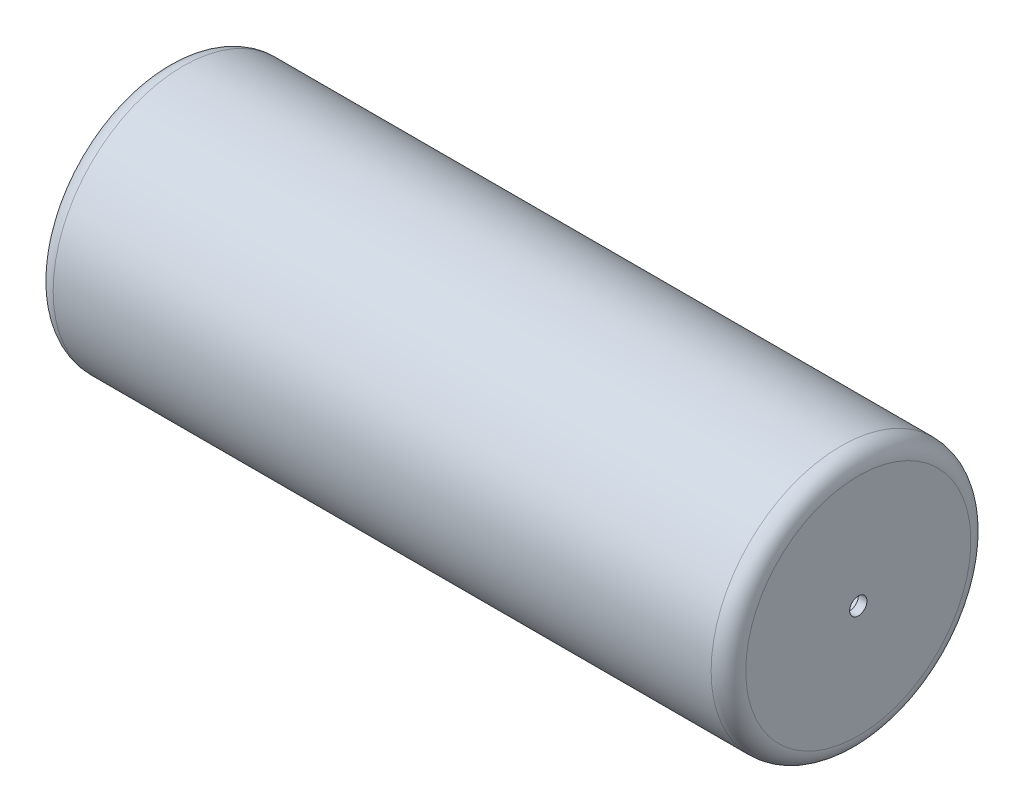
ISO-10303-21;
HEADER;
FILE_DESCRIPTION(('STEP AP214'),'2;1');
FILE_NAME('part.step','',(''),(''),'','','');
FILE_SCHEMA(('AUTOMOTIVE_DESIGN { 1 0 10303 214 1 1 1 1 }'));
ENDSEC;
DATA;
#1=APPLICATION_CONTEXT('core data for automotive mechanical design processes');
#2=APPLICATION_PROTOCOL_DEFINITION('international standard','automotive_design',2000,#1);
#3=PRODUCT_CONTEXT('',#1,'mechanical');
#4=PRODUCT('Part','Part','',(#3));
#5=PRODUCT_RELATED_PRODUCT_CATEGORY('part','',(#4));
#6=PRODUCT_DEFINITION_FORMATION('','',#4);
#7=PRODUCT_DEFINITION_CONTEXT('part definition',#1,'design');
#8=PRODUCT_DEFINITION('design','',#6,#7);
#9=PRODUCT_DEFINITION_SHAPE('','',#8);
#10=(LENGTH_UNIT() NAMED_UNIT(*) SI_UNIT(.MILLI.,.METRE.));
#11=(NAMED_UNIT(*) PLANE_ANGLE_UNIT() SI_UNIT($,.RADIAN.));
#12=(NAMED_UNIT(*) SI_UNIT($,.STERADIAN.) SOLID_ANGLE_UNIT());
#13=UNCERTAINTY_MEASURE_WITH_UNIT(LENGTH_MEASURE(1.E-05),#10,'distance_accuracy_value','');
#14=(GEOMETRIC_REPRESENTATION_CONTEXT(3) GLOBAL_UNCERTAINTY_ASSIGNED_CONTEXT((#13)) GLOBAL_UNIT_ASSIGNED_CONTEXT((#10,
#11,#12)) REPRESENTATION_CONTEXT('',''));
#15=CARTESIAN_POINT('',(0.,0.,0.));
#16=DIRECTION('',(0.,0.,1.));
#17=DIRECTION('',(1.,0.,0.));
#18=AXIS2_PLACEMENT_3D('',#15,#16,#17);
#19=CARTESIAN_POINT('',(0.,15.,0.));
#20=DIRECTION('',(1.,0.,0.));
#21=DIRECTION('',(0.,0.,-1.));
#22=AXIS2_PLACEMENT_3D('',#19,#20,#21);
#23=PLANE('',#22);
#24=CARTESIAN_POINT('',(0.,0.,0.));
#25=DIRECTION('',(1.,0.,0.));
#26=DIRECTION('',(0.,0.,-1.));
#27=AXIS2_PLACEMENT_3D('',#24,#25,#26);
#28=CIRCLE('',#27,13.);
#29=CARTESIAN_POINT('',(0.,0.,-13.));
#30=VERTEX_POINT('',#29);
#31=EDGE_CURVE('E61',#30,#30,#28,.F.);
#32=ORIENTED_EDGE('',*,*,#31,.T.);
#33=EDGE_LOOP('',(#32));
#34=FACE_BOUND('',#33,.T.);
#35=ADVANCED_FACE('F43',(#34),#23,.F.);
#36=CARTESIAN_POINT('',(80.,0.,0.));
#37=DIRECTION('',(-1.,0.,0.));
#38=DIRECTION('',(0.,0.,1.));
#39=AXIS2_PLACEMENT_3D('',#36,#37,#38);
#40=PLANE('',#39);
#41=CARTESIAN_POINT('',(80.,0.,0.));
#42=DIRECTION('',(-1.,0.,0.));
#43=DIRECTION('',(0.,0.,1.));
#44=AXIS2_PLACEMENT_3D('',#41,#42,#43);
#45=CIRCLE('',#44,13.);
#46=CARTESIAN_POINT('',(80.,0.,13.));
#47=VERTEX_POINT('',#46);
#48=EDGE_CURVE('E10',#47,#47,#45,.F.);
#49=ORIENTED_EDGE('',*,*,#48,.T.);
#50=EDGE_LOOP('',(#49));
#51=FACE_BOUND('',#50,.T.);
#52=CARTESIAN_POINT('',(80.,0.,0.));
#53=DIRECTION('',(1.,0.,0.));
#54=DIRECTION('',(0.,0.,-1.));
#55=AXIS2_PLACEMENT_3D('',#52,#53,#54);
#56=CIRCLE('',#55,1.);
#57=CARTESIAN_POINT('',(80.,0.,-1.));
#58=VERTEX_POINT('',#57);
#59=EDGE_CURVE('E73',#58,#58,#56,.T.);
#60=ORIENTED_EDGE('',*,*,#59,.F.);
#61=EDGE_LOOP('',(#60));
#62=FACE_BOUND('',#61,.T.);
#63=ADVANCED_FACE('F86',(#51,#62),#40,.F.);
#64=CARTESIAN_POINT('',(0.,0.,0.));
#65=DIRECTION('',(-1.,0.,0.));
#66=DIRECTION('',(0.,0.,1.));
#67=AXIS2_PLACEMENT_3D('',#64,#65,#66);
#68=CYLINDRICAL_SURFACE('',#67,15.);
#69=CARTESIAN_POINT('',(2.,0.,0.));
#70=DIRECTION('',(1.,0.,0.));
#71=DIRECTION('',(0.,0.,-1.));
#72=AXIS2_PLACEMENT_3D('',#69,#70,#71);
#73=CIRCLE('',#72,15.);
#74=CARTESIAN_POINT('',(2.,0.,-15.));
#75=VERTEX_POINT('',#74);
#76=EDGE_CURVE('E51',#75,#75,#73,.T.);
#77=ORIENTED_EDGE('',*,*,#76,.T.);
#78=EDGE_LOOP('',(#77));
#79=FACE_BOUND('',#78,.T.);
#80=CARTESIAN_POINT('',(78.,0.,0.));
#81=DIRECTION('',(-1.,0.,0.));
#82=DIRECTION('',(0.,0.,1.));
#83=AXIS2_PLACEMENT_3D('',#80,#81,#82);
#84=CIRCLE('',#83,15.);
#85=CARTESIAN_POINT('',(78.,0.,15.));
#86=VERTEX_POINT('',#85);
#87=EDGE_CURVE('E56',#86,#86,#84,.T.);
#88=ORIENTED_EDGE('',*,*,#87,.T.);
#89=EDGE_LOOP('',(#88));
#90=FACE_BOUND('',#89,.T.);
#91=ADVANCED_FACE('F88',(#79,#90),#68,.T.);
#92=CARTESIAN_POINT('',(70.,0.,0.));
#93=DIRECTION('',(1.,0.,0.));
#94=DIRECTION('',(0.,0.,-1.));
#95=AXIS2_PLACEMENT_3D('',#92,#93,#94);
#96=CYLINDRICAL_SURFACE('',#95,1.);
#97=CARTESIAN_POINT('',(79.,0.,0.));
#98=DIRECTION('',(-1.,0.,0.));
#99=DIRECTION('',(0.,0.,1.));
#100=AXIS2_PLACEMENT_3D('',#97,#98,#99);
#101=CIRCLE('',#100,1.);
#102=CARTESIAN_POINT('',(79.,0.,1.));
#103=VERTEX_POINT('',#102);
#104=EDGE_CURVE('E68',#103,#103,#101,.T.);
#105=ORIENTED_EDGE('',*,*,#104,.T.);
#106=EDGE_LOOP('',(#105));
#107=FACE_BOUND('',#106,.T.);
#108=ORIENTED_EDGE('',*,*,#59,.T.);
#109=EDGE_LOOP('',(#108));
#110=FACE_BOUND('',#109,.T.);
#111=ADVANCED_FACE('F84',(#107,#110),#96,.F.);
#112=CARTESIAN_POINT('',(1.,15.,0.));
#113=DIRECTION('',(1.,0.,0.));
#114=DIRECTION('',(0.,0.,-1.));
#115=AXIS2_PLACEMENT_3D('',#112,#113,#114);
#116=PLANE('',#115);
#117=CARTESIAN_POINT('',(1.,0.,0.));
#118=DIRECTION('',(1.,0.,0.));
#119=DIRECTION('',(0.,0.,-1.));
#120=AXIS2_PLACEMENT_3D('',#117,#118,#119);
#121=CIRCLE('',#120,14.);
#122=CARTESIAN_POINT('',(1.,0.,-14.));
#123=VERTEX_POINT('',#122);
#124=EDGE_CURVE('E72',#123,#123,#121,.F.);
#125=ORIENTED_EDGE('',*,*,#124,.F.);
#126=EDGE_LOOP('',(#125));
#127=FACE_BOUND('',#126,.T.);
#128=ADVANCED_FACE('F99',(#127),#116,.T.);
#129=CARTESIAN_POINT('',(79.,0.,0.));
#130=DIRECTION('',(-1.,0.,0.));
#131=DIRECTION('',(0.,0.,1.));
#132=AXIS2_PLACEMENT_3D('',#129,#130,#131);
#133=PLANE('',#132);
#134=ORIENTED_EDGE('',*,*,#104,.F.);
#135=EDGE_LOOP('',(#134));
#136=FACE_BOUND('',#135,.T.);
#137=CARTESIAN_POINT('',(79.,0.,0.));
#138=DIRECTION('',(-1.,0.,0.));
#139=DIRECTION('',(0.,0.,1.));
#140=AXIS2_PLACEMENT_3D('',#137,#138,#139);
#141=CIRCLE('',#140,14.);
#142=CARTESIAN_POINT('',(79.,0.,14.));
#143=VERTEX_POINT('',#142);
#144=EDGE_CURVE('E67',#143,#143,#141,.T.);
#145=ORIENTED_EDGE('',*,*,#144,.T.);
#146=EDGE_LOOP('',(#145));
#147=FACE_BOUND('',#146,.T.);
#148=ADVANCED_FACE('F102',(#136,#147),#133,.T.);
#149=CARTESIAN_POINT('',(0.,0.,0.));
#150=DIRECTION('',(-1.,0.,0.));
#151=DIRECTION('',(0.,0.,1.));
#152=AXIS2_PLACEMENT_3D('',#149,#150,#151);
#153=CYLINDRICAL_SURFACE('',#152,14.);
#154=ORIENTED_EDGE('',*,*,#124,.T.);
#155=EDGE_LOOP('',(#154));
#156=FACE_BOUND('',#155,.T.);
#157=ORIENTED_EDGE('',*,*,#144,.F.);
#158=EDGE_LOOP('',(#157));
#159=FACE_BOUND('',#158,.T.);
#160=ADVANCED_FACE('F106',(#156,#159),#153,.F.);
#161=CARTESIAN_POINT('',(2.,0.,0.));
#162=DIRECTION('',(1.,0.,0.));
#163=DIRECTION('',(0.,0.,-1.));
#164=AXIS2_PLACEMENT_3D('',#161,#162,#163);
#165=TOROIDAL_SURFACE('',#164,13.,2.);
#166=ORIENTED_EDGE('',*,*,#76,.F.);
#167=EDGE_LOOP('',(#166));
#168=FACE_BOUND('',#167,.T.);
#169=ORIENTED_EDGE('',*,*,#31,.F.);
#170=EDGE_LOOP('',(#169));
#171=FACE_BOUND('',#170,.T.);
#172=ADVANCED_FACE('F109',(#168,#171),#165,.T.);
#173=CARTESIAN_POINT('',(78.,0.,0.));
#174=DIRECTION('',(-1.,0.,0.));
#175=DIRECTION('',(0.,0.,1.));
#176=AXIS2_PLACEMENT_3D('',#173,#174,#175);
#177=TOROIDAL_SURFACE('',#176,13.,2.);
#178=ORIENTED_EDGE('',*,*,#48,.F.);
#179=EDGE_LOOP('',(#178));
#180=FACE_BOUND('',#179,.T.);
#181=ORIENTED_EDGE('',*,*,#87,.F.);
#182=EDGE_LOOP('',(#181));
#183=FACE_BOUND('',#182,.T.);
#184=ADVANCED_FACE('F45',(#180,#183),#177,.T.);
#185=CLOSED_SHELL('',(#35,#63,#91,#111,#128,#148,#160,#172,#184));
#186=MANIFOLD_SOLID_BREP('B2',#185);
#187=ADVANCED_BREP_SHAPE_REPRESENTATION('',(#18,#186),#14);
#188=SHAPE_DEFINITION_REPRESENTATION(#9,#187);
ENDSEC;
END-ISO-10303-21;
